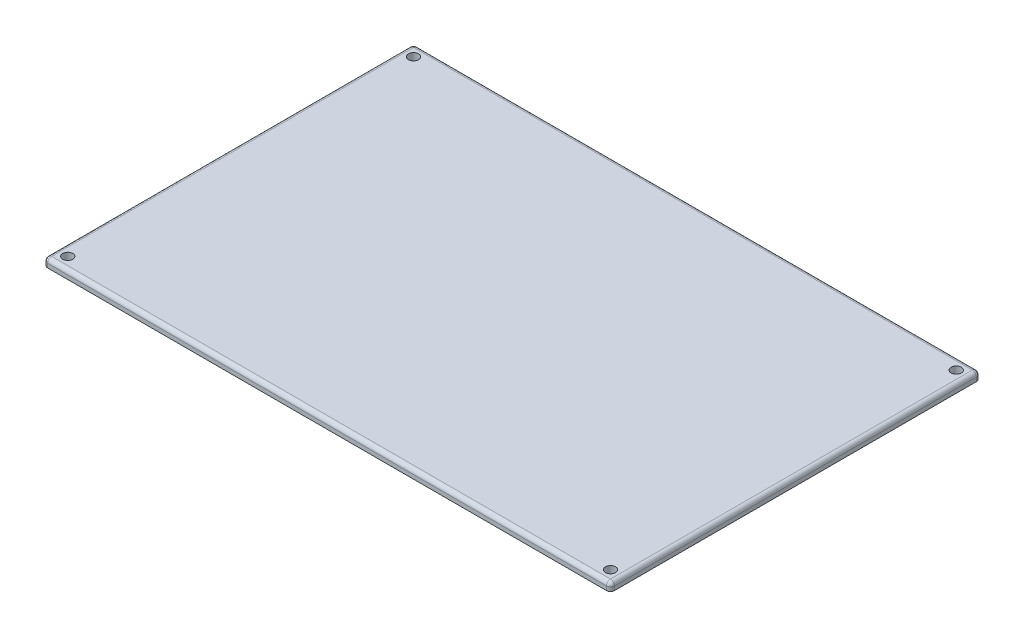
ISO-10303-21;
HEADER;
FILE_DESCRIPTION(('STEP AP214'),'2;1');
FILE_NAME('part.step','',(''),(''),'','','');
FILE_SCHEMA(('AUTOMOTIVE_DESIGN { 1 0 10303 214 1 1 1 1 }'));
ENDSEC;
DATA;
#1=APPLICATION_CONTEXT('core data for automotive mechanical design processes');
#2=APPLICATION_PROTOCOL_DEFINITION('international standard','automotive_design',2000,#1);
#3=PRODUCT_CONTEXT('',#1,'mechanical');
#4=PRODUCT('Part','Part','',(#3));
#5=PRODUCT_RELATED_PRODUCT_CATEGORY('part','',(#4));
#6=PRODUCT_DEFINITION_FORMATION('','',#4);
#7=PRODUCT_DEFINITION_CONTEXT('part definition',#1,'design');
#8=PRODUCT_DEFINITION('design','',#6,#7);
#9=PRODUCT_DEFINITION_SHAPE('','',#8);
#10=(LENGTH_UNIT() NAMED_UNIT(*) SI_UNIT(.MILLI.,.METRE.));
#11=(NAMED_UNIT(*) PLANE_ANGLE_UNIT() SI_UNIT($,.RADIAN.));
#12=(NAMED_UNIT(*) SI_UNIT($,.STERADIAN.) SOLID_ANGLE_UNIT());
#13=UNCERTAINTY_MEASURE_WITH_UNIT(LENGTH_MEASURE(1.E-05),#10,'distance_accuracy_value','');
#14=(GEOMETRIC_REPRESENTATION_CONTEXT(3) GLOBAL_UNCERTAINTY_ASSIGNED_CONTEXT((#13)) GLOBAL_UNIT_ASSIGNED_CONTEXT((#10,
#11,#12)) REPRESENTATION_CONTEXT('',''));
#15=CARTESIAN_POINT('',(0.,0.,0.));
#16=DIRECTION('',(0.,0.,1.));
#17=DIRECTION('',(1.,0.,0.));
#18=AXIS2_PLACEMENT_3D('',#15,#16,#17);
#19=CARTESIAN_POINT('',(0.,0.,0.));
#20=DIRECTION('',(0.,-1.,0.));
#21=DIRECTION('',(0.,0.,-1.));
#22=AXIS2_PLACEMENT_3D('',#19,#20,#21);
#23=PLANE('',#22);
#24=CARTESIAN_POINT('',(3.,0.,-89.));
#25=DIRECTION('',(0.,-1.,0.));
#26=DIRECTION('',(0.,0.,1.));
#27=AXIS2_PLACEMENT_3D('',#24,#25,#26);
#28=CIRCLE('',#27,1.26);
#29=CARTESIAN_POINT('',(3.,0.,-87.74));
#30=VERTEX_POINT('',#29);
#31=EDGE_CURVE('E277',#30,#30,#28,.T.);
#32=ORIENTED_EDGE('',*,*,#31,.F.);
#33=EDGE_LOOP('',(#32));
#34=FACE_BOUND('',#33,.T.);
#35=CARTESIAN_POINT('',(138.,0.,-89.));
#36=DIRECTION('',(0.,-1.,0.));
#37=DIRECTION('',(0.,0.,-1.));
#38=AXIS2_PLACEMENT_3D('',#35,#36,#37);
#39=CIRCLE('',#38,1.26);
#40=CARTESIAN_POINT('',(138.,0.,-90.26));
#41=VERTEX_POINT('',#40);
#42=EDGE_CURVE('E283',#41,#41,#39,.T.);
#43=ORIENTED_EDGE('',*,*,#42,.F.);
#44=EDGE_LOOP('',(#43));
#45=FACE_BOUND('',#44,.T.);
#46=CARTESIAN_POINT('',(138.,0.,-3.));
#47=DIRECTION('',(0.,-1.,0.));
#48=DIRECTION('',(0.,0.,1.));
#49=AXIS2_PLACEMENT_3D('',#46,#47,#48);
#50=CIRCLE('',#49,1.25999999999999);
#51=CARTESIAN_POINT('',(138.,0.,-1.74000000000001));
#52=VERTEX_POINT('',#51);
#53=EDGE_CURVE('E278',#52,#52,#50,.T.);
#54=ORIENTED_EDGE('',*,*,#53,.F.);
#55=EDGE_LOOP('',(#54));
#56=FACE_BOUND('',#55,.T.);
#57=CARTESIAN_POINT('',(3.,0.,-3.));
#58=DIRECTION('',(0.,-1.,0.));
#59=DIRECTION('',(0.,0.,-1.));
#60=AXIS2_PLACEMENT_3D('',#57,#58,#59);
#61=CIRCLE('',#60,1.26);
#62=CARTESIAN_POINT('',(3.,0.,-4.26));
#63=VERTEX_POINT('',#62);
#64=EDGE_CURVE('E282',#63,#63,#61,.T.);
#65=ORIENTED_EDGE('',*,*,#64,.F.);
#66=EDGE_LOOP('',(#65));
#67=FACE_BOUND('',#66,.T.);
#68=DIRECTION('',(1.,0.,0.));
#69=VECTOR('',#68,1.);
#70=CARTESIAN_POINT('',(0.,0.,0.));
#71=LINE('',#70,#69);
#72=CARTESIAN_POINT('',(1.,0.,0.));
#73=VERTEX_POINT('',#72);
#74=CARTESIAN_POINT('',(140.,0.,0.));
#75=VERTEX_POINT('',#74);
#76=EDGE_CURVE('E313',#73,#75,#71,.T.);
#77=ORIENTED_EDGE('',*,*,#76,.F.);
#78=CARTESIAN_POINT('',(1.,0.,-1.));
#79=DIRECTION('',(0.,-1.,0.));
#80=DIRECTION('',(0.,0.,-1.));
#81=AXIS2_PLACEMENT_3D('',#78,#79,#80);
#82=CIRCLE('',#81,1.);
#83=CARTESIAN_POINT('',(0.,0.,-1.));
#84=VERTEX_POINT('',#83);
#85=EDGE_CURVE('E397',#73,#84,#82,.T.);
#86=ORIENTED_EDGE('',*,*,#85,.T.);
#87=DIRECTION('',(0.,0.,1.));
#88=VECTOR('',#87,1.);
#89=CARTESIAN_POINT('',(0.,0.,0.));
#90=LINE('',#89,#88);
#91=CARTESIAN_POINT('',(0.,0.,-91.));
#92=VERTEX_POINT('',#91);
#93=EDGE_CURVE('E309',#92,#84,#90,.T.);
#94=ORIENTED_EDGE('',*,*,#93,.F.);
#95=CARTESIAN_POINT('',(1.,0.,-91.));
#96=DIRECTION('',(0.,-1.,0.));
#97=DIRECTION('',(0.,0.,-1.));
#98=AXIS2_PLACEMENT_3D('',#95,#96,#97);
#99=CIRCLE('',#98,1.);
#100=CARTESIAN_POINT('',(1.,0.,-92.));
#101=VERTEX_POINT('',#100);
#102=EDGE_CURVE('E389',#92,#101,#99,.T.);
#103=ORIENTED_EDGE('',*,*,#102,.T.);
#104=DIRECTION('',(-1.,0.,0.));
#105=VECTOR('',#104,1.);
#106=CARTESIAN_POINT('',(0.,0.,-92.));
#107=LINE('',#106,#105);
#108=CARTESIAN_POINT('',(140.,0.,-92.));
#109=VERTEX_POINT('',#108);
#110=EDGE_CURVE('E320',#109,#101,#107,.T.);
#111=ORIENTED_EDGE('',*,*,#110,.F.);
#112=CARTESIAN_POINT('',(140.,0.,-91.));
#113=DIRECTION('',(0.,-1.,0.));
#114=DIRECTION('',(0.,0.,-1.));
#115=AXIS2_PLACEMENT_3D('',#112,#113,#114);
#116=CIRCLE('',#115,1.);
#117=CARTESIAN_POINT('',(141.,0.,-91.));
#118=VERTEX_POINT('',#117);
#119=EDGE_CURVE('E67',#109,#118,#116,.T.);
#120=ORIENTED_EDGE('',*,*,#119,.T.);
#121=DIRECTION('',(0.,0.,-1.));
#122=VECTOR('',#121,1.);
#123=CARTESIAN_POINT('',(141.,0.,0.));
#124=LINE('',#123,#122);
#125=CARTESIAN_POINT('',(141.,0.,-1.));
#126=VERTEX_POINT('',#125);
#127=EDGE_CURVE('E317',#126,#118,#124,.T.);
#128=ORIENTED_EDGE('',*,*,#127,.F.);
#129=CARTESIAN_POINT('',(140.,0.,-1.));
#130=DIRECTION('',(0.,-1.,0.));
#131=DIRECTION('',(0.,0.,-1.));
#132=AXIS2_PLACEMENT_3D('',#129,#130,#131);
#133=CIRCLE('',#132,1.);
#134=EDGE_CURVE('E394',#126,#75,#133,.T.);
#135=ORIENTED_EDGE('',*,*,#134,.T.);
#136=EDGE_LOOP('',(#77,#86,#94,#103,#111,#120,#128,#135));
#137=FACE_BOUND('',#136,.T.);
#138=CARTESIAN_POINT('',(3.,0.,-3.));
#139=DIRECTION('',(0.,-1.,0.));
#140=DIRECTION('',(0.,0.,-1.));
#141=AXIS2_PLACEMENT_3D('',#138,#139,#140);
#142=CIRCLE('',#141,2.76);
#143=CARTESIAN_POINT('',(1.5,0.,-5.31680814915694));
#144=VERTEX_POINT('',#143);
#145=CARTESIAN_POINT('',(5.31680814915694,0.,-1.5));
#146=VERTEX_POINT('',#145);
#147=EDGE_CURVE('E230',#144,#146,#142,.T.);
#148=ORIENTED_EDGE('',*,*,#147,.T.);
#149=DIRECTION('',(1.,0.,0.));
#150=VECTOR('',#149,1.);
#151=CARTESIAN_POINT('',(0.,0.,-1.5));
#152=LINE('',#151,#150);
#153=CARTESIAN_POINT('',(135.683191850843,0.,-1.5));
#154=VERTEX_POINT('',#153);
#155=EDGE_CURVE('E233',#146,#154,#152,.T.);
#156=ORIENTED_EDGE('',*,*,#155,.T.);
#157=CARTESIAN_POINT('',(138.,0.,-3.));
#158=DIRECTION('',(0.,-1.,0.));
#159=DIRECTION('',(0.,0.,-1.));
#160=AXIS2_PLACEMENT_3D('',#157,#158,#159);
#161=CIRCLE('',#160,2.75999999999999);
#162=CARTESIAN_POINT('',(139.5,0.,-5.31680814915695));
#163=VERTEX_POINT('',#162);
#164=EDGE_CURVE('E247',#154,#163,#161,.T.);
#165=ORIENTED_EDGE('',*,*,#164,.T.);
#166=DIRECTION('',(0.,0.,-1.));
#167=VECTOR('',#166,1.);
#168=CARTESIAN_POINT('',(139.5,0.,0.));
#169=LINE('',#168,#167);
#170=CARTESIAN_POINT('',(139.5,0.,-86.683191850843));
#171=VERTEX_POINT('',#170);
#172=EDGE_CURVE('E237',#163,#171,#169,.T.);
#173=ORIENTED_EDGE('',*,*,#172,.T.);
#174=CARTESIAN_POINT('',(138.,0.,-89.));
#175=DIRECTION('',(0.,-1.,0.));
#176=DIRECTION('',(0.,0.,-1.));
#177=AXIS2_PLACEMENT_3D('',#174,#175,#176);
#178=CIRCLE('',#177,2.75999999999999);
#179=CARTESIAN_POINT('',(135.683191850843,0.,-90.5));
#180=VERTEX_POINT('',#179);
#181=EDGE_CURVE('E251',#171,#180,#178,.T.);
#182=ORIENTED_EDGE('',*,*,#181,.T.);
#183=DIRECTION('',(-1.,0.,0.));
#184=VECTOR('',#183,1.);
#185=CARTESIAN_POINT('',(0.,0.,-90.5));
#186=LINE('',#185,#184);
#187=CARTESIAN_POINT('',(5.31680814915694,0.,-90.5));
#188=VERTEX_POINT('',#187);
#189=EDGE_CURVE('E219',#180,#188,#186,.T.);
#190=ORIENTED_EDGE('',*,*,#189,.T.);
#191=CARTESIAN_POINT('',(3.,0.,-89.));
#192=DIRECTION('',(0.,-1.,0.));
#193=DIRECTION('',(0.,0.,-1.));
#194=AXIS2_PLACEMENT_3D('',#191,#192,#193);
#195=CIRCLE('',#194,2.76);
#196=CARTESIAN_POINT('',(1.5,0.,-86.6831918508431));
#197=VERTEX_POINT('',#196);
#198=EDGE_CURVE('E255',#188,#197,#195,.T.);
#199=ORIENTED_EDGE('',*,*,#198,.T.);
#200=DIRECTION('',(0.,0.,1.));
#201=VECTOR('',#200,1.);
#202=CARTESIAN_POINT('',(1.5,0.,0.));
#203=LINE('',#202,#201);
#204=EDGE_CURVE('E184',#197,#144,#203,.T.);
#205=ORIENTED_EDGE('',*,*,#204,.T.);
#206=EDGE_LOOP('',(#148,#156,#165,#173,#182,#190,#199,#205));
#207=FACE_BOUND('',#206,.T.);
#208=ADVANCED_FACE('F49',(#34,#45,#56,#67,#137,#207),#23,.T.);
#209=CARTESIAN_POINT('',(0.,2.,0.));
#210=DIRECTION('',(1.,0.,0.));
#211=DIRECTION('',(0.,0.,-1.));
#212=AXIS2_PLACEMENT_3D('',#209,#210,#211);
#213=PLANE('',#212);
#214=ORIENTED_EDGE('',*,*,#93,.T.);
#215=DIRECTION('',(0.,-1.,0.));
#216=VECTOR('',#215,1.);
#217=CARTESIAN_POINT('',(0.,2.,-1.));
#218=LINE('',#217,#216);
#219=CARTESIAN_POINT('',(0.,1.,-1.));
#220=VERTEX_POINT('',#219);
#221=EDGE_CURVE('E403',#84,#220,#218,.F.);
#222=ORIENTED_EDGE('',*,*,#221,.T.);
#223=DIRECTION('',(0.,0.,1.));
#224=VECTOR('',#223,1.);
#225=CARTESIAN_POINT('',(0.,1.,0.));
#226=LINE('',#225,#224);
#227=CARTESIAN_POINT('',(0.,1.,-91.));
#228=VERTEX_POINT('',#227);
#229=EDGE_CURVE('E347',#220,#228,#226,.F.);
#230=ORIENTED_EDGE('',*,*,#229,.T.);
#231=DIRECTION('',(0.,-1.,0.));
#232=VECTOR('',#231,1.);
#233=CARTESIAN_POINT('',(0.,2.,-91.));
#234=LINE('',#233,#232);
#235=EDGE_CURVE('E400',#228,#92,#234,.T.);
#236=ORIENTED_EDGE('',*,*,#235,.T.);
#237=EDGE_LOOP('',(#214,#222,#230,#236));
#238=FACE_BOUND('',#237,.T.);
#239=ADVANCED_FACE('F435',(#238),#213,.F.);
#240=CARTESIAN_POINT('',(0.,2.,0.));
#241=DIRECTION('',(0.,0.,-1.));
#242=DIRECTION('',(-1.,0.,0.));
#243=AXIS2_PLACEMENT_3D('',#240,#241,#242);
#244=PLANE('',#243);
#245=DIRECTION('',(1.,0.,0.));
#246=VECTOR('',#245,1.);
#247=CARTESIAN_POINT('',(0.,1.,0.));
#248=LINE('',#247,#246);
#249=CARTESIAN_POINT('',(140.,1.,0.));
#250=VERTEX_POINT('',#249);
#251=CARTESIAN_POINT('',(1.,1.,0.));
#252=VERTEX_POINT('',#251);
#253=EDGE_CURVE('E351',#250,#252,#248,.F.);
#254=ORIENTED_EDGE('',*,*,#253,.T.);
#255=DIRECTION('',(0.,-1.,0.));
#256=VECTOR('',#255,1.);
#257=CARTESIAN_POINT('',(1.,2.,0.));
#258=LINE('',#257,#256);
#259=EDGE_CURVE('E386',#252,#73,#258,.T.);
#260=ORIENTED_EDGE('',*,*,#259,.T.);
#261=ORIENTED_EDGE('',*,*,#76,.T.);
#262=DIRECTION('',(0.,-1.,0.));
#263=VECTOR('',#262,1.);
#264=CARTESIAN_POINT('',(140.,2.,0.));
#265=LINE('',#264,#263);
#266=EDGE_CURVE('E383',#75,#250,#265,.F.);
#267=ORIENTED_EDGE('',*,*,#266,.T.);
#268=EDGE_LOOP('',(#254,#260,#261,#267));
#269=FACE_BOUND('',#268,.T.);
#270=ADVANCED_FACE('F458',(#269),#244,.F.);
#271=CARTESIAN_POINT('',(141.,2.,0.));
#272=DIRECTION('',(-1.,0.,0.));
#273=DIRECTION('',(0.,0.,1.));
#274=AXIS2_PLACEMENT_3D('',#271,#272,#273);
#275=PLANE('',#274);
#276=DIRECTION('',(0.,0.,-1.));
#277=VECTOR('',#276,1.);
#278=CARTESIAN_POINT('',(141.,1.,0.));
#279=LINE('',#278,#277);
#280=CARTESIAN_POINT('',(141.,1.,-91.));
#281=VERTEX_POINT('',#280);
#282=CARTESIAN_POINT('',(141.,1.,-1.));
#283=VERTEX_POINT('',#282);
#284=EDGE_CURVE('E340',#281,#283,#279,.F.);
#285=ORIENTED_EDGE('',*,*,#284,.T.);
#286=DIRECTION('',(0.,-1.,0.));
#287=VECTOR('',#286,1.);
#288=CARTESIAN_POINT('',(141.,2.,-1.));
#289=LINE('',#288,#287);
#290=EDGE_CURVE('E74',#283,#126,#289,.T.);
#291=ORIENTED_EDGE('',*,*,#290,.T.);
#292=ORIENTED_EDGE('',*,*,#127,.T.);
#293=DIRECTION('',(0.,-1.,0.));
#294=VECTOR('',#293,1.);
#295=CARTESIAN_POINT('',(141.,2.,-91.));
#296=LINE('',#295,#294);
#297=EDGE_CURVE('E406',#118,#281,#296,.F.);
#298=ORIENTED_EDGE('',*,*,#297,.T.);
#299=EDGE_LOOP('',(#285,#291,#292,#298));
#300=FACE_BOUND('',#299,.T.);
#301=ADVANCED_FACE('F484',(#300),#275,.F.);
#302=CARTESIAN_POINT('',(0.,2.,-92.));
#303=DIRECTION('',(0.,0.,1.));
#304=DIRECTION('',(1.,0.,0.));
#305=AXIS2_PLACEMENT_3D('',#302,#303,#304);
#306=PLANE('',#305);
#307=DIRECTION('',(-1.,0.,0.));
#308=VECTOR('',#307,1.);
#309=CARTESIAN_POINT('',(0.,1.,-92.));
#310=LINE('',#309,#308);
#311=CARTESIAN_POINT('',(1.,1.,-92.));
#312=VERTEX_POINT('',#311);
#313=CARTESIAN_POINT('',(140.,1.,-92.));
#314=VERTEX_POINT('',#313);
#315=EDGE_CURVE('E343',#312,#314,#310,.F.);
#316=ORIENTED_EDGE('',*,*,#315,.T.);
#317=DIRECTION('',(0.,-1.,0.));
#318=VECTOR('',#317,1.);
#319=CARTESIAN_POINT('',(140.,2.,-92.));
#320=LINE('',#319,#318);
#321=EDGE_CURVE('E11',#314,#109,#320,.T.);
#322=ORIENTED_EDGE('',*,*,#321,.T.);
#323=ORIENTED_EDGE('',*,*,#110,.T.);
#324=DIRECTION('',(0.,-1.,0.));
#325=VECTOR('',#324,1.);
#326=CARTESIAN_POINT('',(1.,2.,-92.));
#327=LINE('',#326,#325);
#328=EDGE_CURVE('E59',#101,#312,#327,.F.);
#329=ORIENTED_EDGE('',*,*,#328,.T.);
#330=EDGE_LOOP('',(#316,#322,#323,#329));
#331=FACE_BOUND('',#330,.T.);
#332=ADVANCED_FACE('F480',(#331),#306,.F.);
#333=CARTESIAN_POINT('',(0.,2.,0.));
#334=DIRECTION('',(0.,-1.,0.));
#335=DIRECTION('',(0.,0.,-1.));
#336=AXIS2_PLACEMENT_3D('',#333,#334,#335);
#337=PLANE('',#336);
#338=DIRECTION('',(1.,0.,0.));
#339=VECTOR('',#338,1.);
#340=CARTESIAN_POINT('',(0.,2.,-1.));
#341=LINE('',#340,#339);
#342=CARTESIAN_POINT('',(1.,2.,-1.));
#343=VERTEX_POINT('',#342);
#344=CARTESIAN_POINT('',(140.,2.,-1.));
#345=VERTEX_POINT('',#344);
#346=EDGE_CURVE('E324',#343,#345,#341,.T.);
#347=ORIENTED_EDGE('',*,*,#346,.T.);
#348=DIRECTION('',(0.,0.,-1.));
#349=VECTOR('',#348,1.);
#350=CARTESIAN_POINT('',(140.,2.,0.));
#351=LINE('',#350,#349);
#352=CARTESIAN_POINT('',(140.,2.,-91.));
#353=VERTEX_POINT('',#352);
#354=EDGE_CURVE('E336',#345,#353,#351,.T.);
#355=ORIENTED_EDGE('',*,*,#354,.T.);
#356=DIRECTION('',(-1.,0.,0.));
#357=VECTOR('',#356,1.);
#358=CARTESIAN_POINT('',(0.,2.,-91.));
#359=LINE('',#358,#357);
#360=CARTESIAN_POINT('',(1.,2.,-91.));
#361=VERTEX_POINT('',#360);
#362=EDGE_CURVE('E332',#353,#361,#359,.T.);
#363=ORIENTED_EDGE('',*,*,#362,.T.);
#364=DIRECTION('',(0.,0.,1.));
#365=VECTOR('',#364,1.);
#366=CARTESIAN_POINT('',(1.,2.,0.));
#367=LINE('',#366,#365);
#368=EDGE_CURVE('E328',#361,#343,#367,.T.);
#369=ORIENTED_EDGE('',*,*,#368,.T.);
#370=EDGE_LOOP('',(#347,#355,#363,#369));
#371=FACE_BOUND('',#370,.T.);
#372=CARTESIAN_POINT('',(3.,2.,-89.));
#373=DIRECTION('',(0.,-1.,0.));
#374=DIRECTION('',(0.,0.,-1.));
#375=AXIS2_PLACEMENT_3D('',#372,#373,#374);
#376=CIRCLE('',#375,1.26);
#377=CARTESIAN_POINT('',(3.,2.,-90.26));
#378=VERTEX_POINT('',#377);
#379=EDGE_CURVE('E305',#378,#378,#376,.T.);
#380=ORIENTED_EDGE('',*,*,#379,.T.);
#381=EDGE_LOOP('',(#380));
#382=FACE_BOUND('',#381,.T.);
#383=CARTESIAN_POINT('',(138.,2.,-89.));
#384=DIRECTION('',(0.,-1.,0.));
#385=DIRECTION('',(0.,0.,-1.));
#386=AXIS2_PLACEMENT_3D('',#383,#384,#385);
#387=CIRCLE('',#386,1.26);
#388=CARTESIAN_POINT('',(138.,2.,-90.26));
#389=VERTEX_POINT('',#388);
#390=EDGE_CURVE('E301',#389,#389,#387,.T.);
#391=ORIENTED_EDGE('',*,*,#390,.T.);
#392=EDGE_LOOP('',(#391));
#393=FACE_BOUND('',#392,.T.);
#394=CARTESIAN_POINT('',(138.,2.,-3.));
#395=DIRECTION('',(0.,-1.,0.));
#396=DIRECTION('',(0.,0.,-1.));
#397=AXIS2_PLACEMENT_3D('',#394,#395,#396);
#398=CIRCLE('',#397,1.25999999999999);
#399=CARTESIAN_POINT('',(138.,2.,-4.25999999999999));
#400=VERTEX_POINT('',#399);
#401=EDGE_CURVE('E297',#400,#400,#398,.T.);
#402=ORIENTED_EDGE('',*,*,#401,.T.);
#403=EDGE_LOOP('',(#402));
#404=FACE_BOUND('',#403,.T.);
#405=CARTESIAN_POINT('',(3.,2.,-3.));
#406=DIRECTION('',(0.,-1.,0.));
#407=DIRECTION('',(0.,0.,-1.));
#408=AXIS2_PLACEMENT_3D('',#405,#406,#407);
#409=CIRCLE('',#408,1.26);
#410=CARTESIAN_POINT('',(3.,2.,-4.26));
#411=VERTEX_POINT('',#410);
#412=EDGE_CURVE('E293',#411,#411,#409,.T.);
#413=ORIENTED_EDGE('',*,*,#412,.T.);
#414=EDGE_LOOP('',(#413));
#415=FACE_BOUND('',#414,.T.);
#416=ADVANCED_FACE('F469',(#371,#382,#393,#404,#415),#337,.F.);
#417=CARTESIAN_POINT('',(3.,10.,-3.));
#418=DIRECTION('',(0.,-1.,0.));
#419=DIRECTION('',(0.,0.,-1.));
#420=AXIS2_PLACEMENT_3D('',#417,#418,#419);
#421=CYLINDRICAL_SURFACE('',#420,1.26);
#422=ORIENTED_EDGE('',*,*,#64,.T.);
#423=EDGE_LOOP('',(#422));
#424=FACE_BOUND('',#423,.T.);
#425=ORIENTED_EDGE('',*,*,#412,.F.);
#426=EDGE_LOOP('',(#425));
#427=FACE_BOUND('',#426,.T.);
#428=ADVANCED_FACE('F506',(#424,#427),#421,.F.);
#429=CARTESIAN_POINT('',(138.,10.,-3.));
#430=DIRECTION('',(0.,-1.,0.));
#431=DIRECTION('',(0.,0.,-1.));
#432=AXIS2_PLACEMENT_3D('',#429,#430,#431);
#433=CYLINDRICAL_SURFACE('',#432,1.25999999999999);
#434=ORIENTED_EDGE('',*,*,#53,.T.);
#435=EDGE_LOOP('',(#434));
#436=FACE_BOUND('',#435,.T.);
#437=ORIENTED_EDGE('',*,*,#401,.F.);
#438=EDGE_LOOP('',(#437));
#439=FACE_BOUND('',#438,.T.);
#440=ADVANCED_FACE('F509',(#436,#439),#433,.F.);
#441=CARTESIAN_POINT('',(138.,10.,-89.));
#442=DIRECTION('',(0.,-1.,0.));
#443=DIRECTION('',(0.,0.,-1.));
#444=AXIS2_PLACEMENT_3D('',#441,#442,#443);
#445=CYLINDRICAL_SURFACE('',#444,1.26);
#446=ORIENTED_EDGE('',*,*,#42,.T.);
#447=EDGE_LOOP('',(#446));
#448=FACE_BOUND('',#447,.T.);
#449=ORIENTED_EDGE('',*,*,#390,.F.);
#450=EDGE_LOOP('',(#449));
#451=FACE_BOUND('',#450,.T.);
#452=ADVANCED_FACE('F514',(#448,#451),#445,.F.);
#453=CARTESIAN_POINT('',(3.,10.,-89.));
#454=DIRECTION('',(0.,-1.,0.));
#455=DIRECTION('',(0.,0.,-1.));
#456=AXIS2_PLACEMENT_3D('',#453,#454,#455);
#457=CYLINDRICAL_SURFACE('',#456,1.26);
#458=ORIENTED_EDGE('',*,*,#31,.T.);
#459=EDGE_LOOP('',(#458));
#460=FACE_BOUND('',#459,.T.);
#461=ORIENTED_EDGE('',*,*,#379,.F.);
#462=EDGE_LOOP('',(#461));
#463=FACE_BOUND('',#462,.T.);
#464=ADVANCED_FACE('F511',(#460,#463),#457,.F.);
#465=CARTESIAN_POINT('',(1.,1.,0.));
#466=DIRECTION('',(0.,0.,1.));
#467=DIRECTION('',(1.,0.,0.));
#468=AXIS2_PLACEMENT_3D('',#465,#466,#467);
#469=CYLINDRICAL_SURFACE('',#468,1.);
#470=ORIENTED_EDGE('',*,*,#229,.F.);
#471=CARTESIAN_POINT('',(1.,1.,-1.));
#472=DIRECTION('',(0.,0.,1.));
#473=DIRECTION('',(1.,0.,0.));
#474=AXIS2_PLACEMENT_3D('',#471,#472,#473);
#475=CIRCLE('',#474,1.);
#476=EDGE_CURVE('E365',#220,#343,#475,.F.);
#477=ORIENTED_EDGE('',*,*,#476,.T.);
#478=ORIENTED_EDGE('',*,*,#368,.F.);
#479=CARTESIAN_POINT('',(1.,1.,-91.));
#480=DIRECTION('',(0.,0.,1.));
#481=DIRECTION('',(1.,0.,0.));
#482=AXIS2_PLACEMENT_3D('',#479,#480,#481);
#483=CIRCLE('',#482,1.);
#484=EDGE_CURVE('E362',#361,#228,#483,.T.);
#485=ORIENTED_EDGE('',*,*,#484,.T.);
#486=EDGE_LOOP('',(#470,#477,#478,#485));
#487=FACE_BOUND('',#486,.T.);
#488=ADVANCED_FACE('F447',(#487),#469,.T.);
#489=CARTESIAN_POINT('',(0.,1.,-1.));
#490=DIRECTION('',(1.,0.,0.));
#491=DIRECTION('',(0.,0.,-1.));
#492=AXIS2_PLACEMENT_3D('',#489,#490,#491);
#493=CYLINDRICAL_SURFACE('',#492,1.);
#494=ORIENTED_EDGE('',*,*,#346,.F.);
#495=CARTESIAN_POINT('',(1.,1.,-1.));
#496=DIRECTION('',(1.,0.,0.));
#497=DIRECTION('',(0.,0.,-1.));
#498=AXIS2_PLACEMENT_3D('',#495,#496,#497);
#499=CIRCLE('',#498,1.);
#500=EDGE_CURVE('E358',#343,#252,#499,.T.);
#501=ORIENTED_EDGE('',*,*,#500,.T.);
#502=ORIENTED_EDGE('',*,*,#253,.F.);
#503=CARTESIAN_POINT('',(140.,1.,-1.));
#504=DIRECTION('',(1.,0.,0.));
#505=DIRECTION('',(0.,0.,-1.));
#506=AXIS2_PLACEMENT_3D('',#503,#504,#505);
#507=CIRCLE('',#506,1.);
#508=EDGE_CURVE('E355',#250,#345,#507,.F.);
#509=ORIENTED_EDGE('',*,*,#508,.T.);
#510=EDGE_LOOP('',(#494,#501,#502,#509));
#511=FACE_BOUND('',#510,.T.);
#512=ADVANCED_FACE('F455',(#511),#493,.T.);
#513=CARTESIAN_POINT('',(0.,1.,-91.));
#514=DIRECTION('',(-1.,0.,0.));
#515=DIRECTION('',(0.,0.,1.));
#516=AXIS2_PLACEMENT_3D('',#513,#514,#515);
#517=CYLINDRICAL_SURFACE('',#516,1.);
#518=ORIENTED_EDGE('',*,*,#362,.F.);
#519=CARTESIAN_POINT('',(140.,1.,-91.));
#520=DIRECTION('',(-1.,0.,0.));
#521=DIRECTION('',(0.,0.,1.));
#522=AXIS2_PLACEMENT_3D('',#519,#520,#521);
#523=CIRCLE('',#522,1.);
#524=EDGE_CURVE('E380',#353,#314,#523,.T.);
#525=ORIENTED_EDGE('',*,*,#524,.T.);
#526=ORIENTED_EDGE('',*,*,#315,.F.);
#527=CARTESIAN_POINT('',(1.,1.,-91.));
#528=DIRECTION('',(-1.,0.,0.));
#529=DIRECTION('',(0.,0.,1.));
#530=AXIS2_PLACEMENT_3D('',#527,#528,#529);
#531=CIRCLE('',#530,1.);
#532=EDGE_CURVE('E376',#312,#361,#531,.F.);
#533=ORIENTED_EDGE('',*,*,#532,.T.);
#534=EDGE_LOOP('',(#518,#525,#526,#533));
#535=FACE_BOUND('',#534,.T.);
#536=ADVANCED_FACE('F476',(#535),#517,.T.);
#537=CARTESIAN_POINT('',(140.,1.,0.));
#538=DIRECTION('',(0.,0.,-1.));
#539=DIRECTION('',(-1.,0.,0.));
#540=AXIS2_PLACEMENT_3D('',#537,#538,#539);
#541=CYLINDRICAL_SURFACE('',#540,1.);
#542=ORIENTED_EDGE('',*,*,#354,.F.);
#543=CARTESIAN_POINT('',(140.,1.,-1.));
#544=DIRECTION('',(0.,0.,-1.));
#545=DIRECTION('',(-1.,0.,0.));
#546=AXIS2_PLACEMENT_3D('',#543,#544,#545);
#547=CIRCLE('',#546,1.);
#548=EDGE_CURVE('E372',#345,#283,#547,.T.);
#549=ORIENTED_EDGE('',*,*,#548,.T.);
#550=ORIENTED_EDGE('',*,*,#284,.F.);
#551=CARTESIAN_POINT('',(140.,1.,-91.));
#552=DIRECTION('',(0.,0.,-1.));
#553=DIRECTION('',(-1.,0.,0.));
#554=AXIS2_PLACEMENT_3D('',#551,#552,#553);
#555=CIRCLE('',#554,1.);
#556=EDGE_CURVE('E368',#281,#353,#555,.F.);
#557=ORIENTED_EDGE('',*,*,#556,.T.);
#558=EDGE_LOOP('',(#542,#549,#550,#557));
#559=FACE_BOUND('',#558,.T.);
#560=ADVANCED_FACE('F472',(#559),#541,.T.);
#561=CARTESIAN_POINT('',(1.5,2.,0.));
#562=DIRECTION('',(1.,0.,0.));
#563=DIRECTION('',(0.,0.,-1.));
#564=AXIS2_PLACEMENT_3D('',#561,#562,#563);
#565=PLANE('',#564);
#566=DIRECTION('',(0.,-1.,0.));
#567=VECTOR('',#566,1.);
#568=CARTESIAN_POINT('',(1.5,10.,-86.6831918508431));
#569=LINE('',#568,#567);
#570=CARTESIAN_POINT('',(1.5,0.5,-86.6831918508431));
#571=VERTEX_POINT('',#570);
#572=EDGE_CURVE('E178',#197,#571,#569,.F.);
#573=ORIENTED_EDGE('',*,*,#572,.T.);
#574=DIRECTION('',(0.,0.,-1.));
#575=VECTOR('',#574,1.);
#576=CARTESIAN_POINT('',(1.5,0.5,0.));
#577=LINE('',#576,#575);
#578=CARTESIAN_POINT('',(1.5,0.5,-5.31680814915694));
#579=VERTEX_POINT('',#578);
#580=EDGE_CURVE('E182',#579,#571,#577,.T.);
#581=ORIENTED_EDGE('',*,*,#580,.F.);
#582=DIRECTION('',(0.,-1.,0.));
#583=VECTOR('',#582,1.);
#584=CARTESIAN_POINT('',(1.5,10.,-5.31680814915694));
#585=LINE('',#584,#583);
#586=EDGE_CURVE('E261',#144,#579,#585,.F.);
#587=ORIENTED_EDGE('',*,*,#586,.F.);
#588=ORIENTED_EDGE('',*,*,#204,.F.);
#589=EDGE_LOOP('',(#573,#581,#587,#588));
#590=FACE_BOUND('',#589,.T.);
#591=ADVANCED_FACE('F180',(#590),#565,.T.);
#592=CARTESIAN_POINT('',(0.,2.,-1.5));
#593=DIRECTION('',(0.,0.,-1.));
#594=DIRECTION('',(-1.,0.,0.));
#595=AXIS2_PLACEMENT_3D('',#592,#593,#594);
#596=PLANE('',#595);
#597=ORIENTED_EDGE('',*,*,#155,.F.);
#598=DIRECTION('',(0.,-1.,0.));
#599=VECTOR('',#598,1.);
#600=CARTESIAN_POINT('',(5.31680814915694,10.,-1.5));
#601=LINE('',#600,#599);
#602=CARTESIAN_POINT('',(5.31680814915694,0.5,-1.5));
#603=VERTEX_POINT('',#602);
#604=EDGE_CURVE('E212',#146,#603,#601,.F.);
#605=ORIENTED_EDGE('',*,*,#604,.T.);
#606=DIRECTION('',(-1.,0.,0.));
#607=VECTOR('',#606,1.);
#608=CARTESIAN_POINT('',(0.,0.5,-1.5));
#609=LINE('',#608,#607);
#610=CARTESIAN_POINT('',(135.683191850843,0.5,-1.5));
#611=VERTEX_POINT('',#610);
#612=EDGE_CURVE('E207',#611,#603,#609,.T.);
#613=ORIENTED_EDGE('',*,*,#612,.F.);
#614=DIRECTION('',(0.,-1.,0.));
#615=VECTOR('',#614,1.);
#616=CARTESIAN_POINT('',(135.683191850843,10.,-1.5));
#617=LINE('',#616,#615);
#618=EDGE_CURVE('E267',#154,#611,#617,.F.);
#619=ORIENTED_EDGE('',*,*,#618,.F.);
#620=EDGE_LOOP('',(#597,#605,#613,#619));
#621=FACE_BOUND('',#620,.T.);
#622=ADVANCED_FACE('F544',(#621),#596,.T.);
#623=CARTESIAN_POINT('',(139.5,2.,0.));
#624=DIRECTION('',(-1.,0.,0.));
#625=DIRECTION('',(0.,0.,1.));
#626=AXIS2_PLACEMENT_3D('',#623,#624,#625);
#627=PLANE('',#626);
#628=ORIENTED_EDGE('',*,*,#172,.F.);
#629=DIRECTION('',(0.,-1.,0.));
#630=VECTOR('',#629,1.);
#631=CARTESIAN_POINT('',(139.5,10.,-5.31680814915695));
#632=LINE('',#631,#630);
#633=CARTESIAN_POINT('',(139.5,0.5,-5.31680814915695));
#634=VERTEX_POINT('',#633);
#635=EDGE_CURVE('E264',#163,#634,#632,.F.);
#636=ORIENTED_EDGE('',*,*,#635,.T.);
#637=DIRECTION('',(0.,0.,1.));
#638=VECTOR('',#637,1.);
#639=CARTESIAN_POINT('',(139.5,0.5,0.));
#640=LINE('',#639,#638);
#641=CARTESIAN_POINT('',(139.5,0.5,-86.683191850843));
#642=VERTEX_POINT('',#641);
#643=EDGE_CURVE('E208',#642,#634,#640,.T.);
#644=ORIENTED_EDGE('',*,*,#643,.F.);
#645=DIRECTION('',(0.,-1.,0.));
#646=VECTOR('',#645,1.);
#647=CARTESIAN_POINT('',(139.5,10.,-86.683191850843));
#648=LINE('',#647,#646);
#649=EDGE_CURVE('E190',#171,#642,#648,.F.);
#650=ORIENTED_EDGE('',*,*,#649,.F.);
#651=EDGE_LOOP('',(#628,#636,#644,#650));
#652=FACE_BOUND('',#651,.T.);
#653=ADVANCED_FACE('F540',(#652),#627,.T.);
#654=CARTESIAN_POINT('',(0.,2.,-90.5));
#655=DIRECTION('',(0.,0.,1.));
#656=DIRECTION('',(1.,0.,0.));
#657=AXIS2_PLACEMENT_3D('',#654,#655,#656);
#658=PLANE('',#657);
#659=ORIENTED_EDGE('',*,*,#189,.F.);
#660=DIRECTION('',(0.,-1.,0.));
#661=VECTOR('',#660,1.);
#662=CARTESIAN_POINT('',(135.683191850843,10.,-90.5));
#663=LINE('',#662,#661);
#664=CARTESIAN_POINT('',(135.683191850843,0.5,-90.5));
#665=VERTEX_POINT('',#664);
#666=EDGE_CURVE('E270',#180,#665,#663,.F.);
#667=ORIENTED_EDGE('',*,*,#666,.T.);
#668=DIRECTION('',(-1.,0.,0.));
#669=VECTOR('',#668,1.);
#670=CARTESIAN_POINT('',(0.,0.5,-90.5));
#671=LINE('',#670,#669);
#672=CARTESIAN_POINT('',(5.31680814915694,0.5,-90.5));
#673=VERTEX_POINT('',#672);
#674=EDGE_CURVE('E215',#665,#673,#671,.T.);
#675=ORIENTED_EDGE('',*,*,#674,.T.);
#676=DIRECTION('',(0.,-1.,0.));
#677=VECTOR('',#676,1.);
#678=CARTESIAN_POINT('',(5.31680814915694,10.,-90.5));
#679=LINE('',#678,#677);
#680=EDGE_CURVE('E189',#188,#673,#679,.F.);
#681=ORIENTED_EDGE('',*,*,#680,.F.);
#682=EDGE_LOOP('',(#659,#667,#675,#681));
#683=FACE_BOUND('',#682,.T.);
#684=ADVANCED_FACE('F537',(#683),#658,.T.);
#685=CARTESIAN_POINT('',(0.,0.5,0.));
#686=DIRECTION('',(0.,-1.,0.));
#687=DIRECTION('',(0.,0.,-1.));
#688=AXIS2_PLACEMENT_3D('',#685,#686,#687);
#689=PLANE('',#688);
#690=CARTESIAN_POINT('',(3.,0.5,-3.));
#691=DIRECTION('',(0.,-1.,0.));
#692=DIRECTION('',(0.,0.,-1.));
#693=AXIS2_PLACEMENT_3D('',#690,#691,#692);
#694=CIRCLE('',#693,2.76);
#695=EDGE_CURVE('E205',#579,#603,#694,.T.);
#696=ORIENTED_EDGE('',*,*,#695,.F.);
#697=ORIENTED_EDGE('',*,*,#580,.T.);
#698=CARTESIAN_POINT('',(3.,0.5,-89.));
#699=DIRECTION('',(0.,-1.,0.));
#700=DIRECTION('',(0.,0.,-1.));
#701=AXIS2_PLACEMENT_3D('',#698,#699,#700);
#702=CIRCLE('',#701,2.76);
#703=EDGE_CURVE('E193',#673,#571,#702,.T.);
#704=ORIENTED_EDGE('',*,*,#703,.F.);
#705=ORIENTED_EDGE('',*,*,#674,.F.);
#706=CARTESIAN_POINT('',(138.,0.5,-89.));
#707=DIRECTION('',(0.,-1.,0.));
#708=DIRECTION('',(0.,0.,-1.));
#709=AXIS2_PLACEMENT_3D('',#706,#707,#708);
#710=CIRCLE('',#709,2.75999999999999);
#711=EDGE_CURVE('E199',#642,#665,#710,.T.);
#712=ORIENTED_EDGE('',*,*,#711,.F.);
#713=ORIENTED_EDGE('',*,*,#643,.T.);
#714=CARTESIAN_POINT('',(138.,0.5,-3.));
#715=DIRECTION('',(0.,-1.,0.));
#716=DIRECTION('',(0.,0.,-1.));
#717=AXIS2_PLACEMENT_3D('',#714,#715,#716);
#718=CIRCLE('',#717,2.75999999999999);
#719=EDGE_CURVE('E224',#611,#634,#718,.T.);
#720=ORIENTED_EDGE('',*,*,#719,.F.);
#721=ORIENTED_EDGE('',*,*,#612,.T.);
#722=EDGE_LOOP('',(#696,#697,#704,#705,#712,#713,#720,#721));
#723=FACE_BOUND('',#722,.T.);
#724=ADVANCED_FACE('F202',(#723),#689,.T.);
#725=CARTESIAN_POINT('',(3.,10.,-3.));
#726=DIRECTION('',(0.,-1.,0.));
#727=DIRECTION('',(0.,0.,-1.));
#728=AXIS2_PLACEMENT_3D('',#725,#726,#727);
#729=CYLINDRICAL_SURFACE('',#728,2.76);
#730=ORIENTED_EDGE('',*,*,#586,.T.);
#731=ORIENTED_EDGE('',*,*,#695,.T.);
#732=ORIENTED_EDGE('',*,*,#604,.F.);
#733=ORIENTED_EDGE('',*,*,#147,.F.);
#734=EDGE_LOOP('',(#730,#731,#732,#733));
#735=FACE_BOUND('',#734,.T.);
#736=ADVANCED_FACE('F530',(#735),#729,.T.);
#737=CARTESIAN_POINT('',(138.,10.,-3.));
#738=DIRECTION('',(0.,-1.,0.));
#739=DIRECTION('',(0.,0.,-1.));
#740=AXIS2_PLACEMENT_3D('',#737,#738,#739);
#741=CYLINDRICAL_SURFACE('',#740,2.75999999999999);
#742=ORIENTED_EDGE('',*,*,#618,.T.);
#743=ORIENTED_EDGE('',*,*,#719,.T.);
#744=ORIENTED_EDGE('',*,*,#635,.F.);
#745=ORIENTED_EDGE('',*,*,#164,.F.);
#746=EDGE_LOOP('',(#742,#743,#744,#745));
#747=FACE_BOUND('',#746,.T.);
#748=ADVANCED_FACE('F526',(#747),#741,.T.);
#749=CARTESIAN_POINT('',(138.,10.,-89.));
#750=DIRECTION('',(0.,-1.,0.));
#751=DIRECTION('',(0.,0.,-1.));
#752=AXIS2_PLACEMENT_3D('',#749,#750,#751);
#753=CYLINDRICAL_SURFACE('',#752,2.75999999999999);
#754=ORIENTED_EDGE('',*,*,#649,.T.);
#755=ORIENTED_EDGE('',*,*,#711,.T.);
#756=ORIENTED_EDGE('',*,*,#666,.F.);
#757=ORIENTED_EDGE('',*,*,#181,.F.);
#758=EDGE_LOOP('',(#754,#755,#756,#757));
#759=FACE_BOUND('',#758,.T.);
#760=ADVANCED_FACE('F523',(#759),#753,.T.);
#761=CARTESIAN_POINT('',(3.,10.,-89.));
#762=DIRECTION('',(0.,-1.,0.));
#763=DIRECTION('',(0.,0.,-1.));
#764=AXIS2_PLACEMENT_3D('',#761,#762,#763);
#765=CYLINDRICAL_SURFACE('',#764,2.76);
#766=ORIENTED_EDGE('',*,*,#680,.T.);
#767=ORIENTED_EDGE('',*,*,#703,.T.);
#768=ORIENTED_EDGE('',*,*,#572,.F.);
#769=ORIENTED_EDGE('',*,*,#198,.F.);
#770=EDGE_LOOP('',(#766,#767,#768,#769));
#771=FACE_BOUND('',#770,.T.);
#772=ADVANCED_FACE('F194',(#771),#765,.T.);
#773=CARTESIAN_POINT('',(1.,2.,-1.));
#774=DIRECTION('',(0.,-1.,0.));
#775=DIRECTION('',(0.,0.,-1.));
#776=AXIS2_PLACEMENT_3D('',#773,#774,#775);
#777=CYLINDRICAL_SURFACE('',#776,1.);
#778=ORIENTED_EDGE('',*,*,#85,.F.);
#779=ORIENTED_EDGE('',*,*,#259,.F.);
#780=CARTESIAN_POINT('',(1.,1.,-1.));
#781=DIRECTION('',(0.,1.,0.));
#782=DIRECTION('',(0.,0.,1.));
#783=AXIS2_PLACEMENT_3D('',#780,#781,#782);
#784=CIRCLE('',#783,1.);
#785=EDGE_CURVE('E258',#220,#252,#784,.T.);
#786=ORIENTED_EDGE('',*,*,#785,.F.);
#787=ORIENTED_EDGE('',*,*,#221,.F.);
#788=EDGE_LOOP('',(#778,#779,#786,#787));
#789=FACE_BOUND('',#788,.T.);
#790=ADVANCED_FACE('F443',(#789),#777,.T.);
#791=CARTESIAN_POINT('',(1.,1.,-1.));
#792=DIRECTION('',(0.,0.,1.));
#793=DIRECTION('',(1.,0.,0.));
#794=AXIS2_PLACEMENT_3D('',#791,#792,#793);
#795=SPHERICAL_SURFACE('',#794,1.);
#796=ORIENTED_EDGE('',*,*,#500,.F.);
#797=ORIENTED_EDGE('',*,*,#476,.F.);
#798=ORIENTED_EDGE('',*,*,#785,.T.);
#799=EDGE_LOOP('',(#796,#797,#798));
#800=FACE_BOUND('',#799,.T.);
#801=ADVANCED_FACE('F451',(#800),#795,.T.);
#802=CARTESIAN_POINT('',(140.,2.,-1.));
#803=DIRECTION('',(0.,-1.,0.));
#804=DIRECTION('',(0.,0.,-1.));
#805=AXIS2_PLACEMENT_3D('',#802,#803,#804);
#806=CYLINDRICAL_SURFACE('',#805,1.);
#807=ORIENTED_EDGE('',*,*,#134,.F.);
#808=ORIENTED_EDGE('',*,*,#290,.F.);
#809=CARTESIAN_POINT('',(140.,1.,-1.));
#810=DIRECTION('',(0.,1.,0.));
#811=DIRECTION('',(0.,0.,1.));
#812=AXIS2_PLACEMENT_3D('',#809,#810,#811);
#813=CIRCLE('',#812,1.);
#814=EDGE_CURVE('E415',#250,#283,#813,.T.);
#815=ORIENTED_EDGE('',*,*,#814,.F.);
#816=ORIENTED_EDGE('',*,*,#266,.F.);
#817=EDGE_LOOP('',(#807,#808,#815,#816));
#818=FACE_BOUND('',#817,.T.);
#819=ADVANCED_FACE('F463',(#818),#806,.T.);
#820=CARTESIAN_POINT('',(140.,1.,-1.));
#821=DIRECTION('',(0.,0.,1.));
#822=DIRECTION('',(1.,0.,0.));
#823=AXIS2_PLACEMENT_3D('',#820,#821,#822);
#824=SPHERICAL_SURFACE('',#823,1.);
#825=ORIENTED_EDGE('',*,*,#548,.F.);
#826=ORIENTED_EDGE('',*,*,#508,.F.);
#827=ORIENTED_EDGE('',*,*,#814,.T.);
#828=EDGE_LOOP('',(#825,#826,#827));
#829=FACE_BOUND('',#828,.T.);
#830=ADVANCED_FACE('F466',(#829),#824,.T.);
#831=CARTESIAN_POINT('',(140.,2.,-91.));
#832=DIRECTION('',(0.,-1.,0.));
#833=DIRECTION('',(0.,0.,-1.));
#834=AXIS2_PLACEMENT_3D('',#831,#832,#833);
#835=CYLINDRICAL_SURFACE('',#834,1.);
#836=ORIENTED_EDGE('',*,*,#119,.F.);
#837=ORIENTED_EDGE('',*,*,#321,.F.);
#838=CARTESIAN_POINT('',(140.,1.,-91.));
#839=DIRECTION('',(0.,1.,0.));
#840=DIRECTION('',(0.,0.,1.));
#841=AXIS2_PLACEMENT_3D('',#838,#839,#840);
#842=CIRCLE('',#841,1.);
#843=EDGE_CURVE('E417',#281,#314,#842,.T.);
#844=ORIENTED_EDGE('',*,*,#843,.F.);
#845=ORIENTED_EDGE('',*,*,#297,.F.);
#846=EDGE_LOOP('',(#836,#837,#844,#845));
#847=FACE_BOUND('',#846,.T.);
#848=ADVANCED_FACE('F482',(#847),#835,.T.);
#849=CARTESIAN_POINT('',(140.,1.,-91.));
#850=DIRECTION('',(0.,0.,1.));
#851=DIRECTION('',(1.,0.,0.));
#852=AXIS2_PLACEMENT_3D('',#849,#850,#851);
#853=SPHERICAL_SURFACE('',#852,1.);
#854=ORIENTED_EDGE('',*,*,#843,.T.);
#855=ORIENTED_EDGE('',*,*,#524,.F.);
#856=ORIENTED_EDGE('',*,*,#556,.F.);
#857=EDGE_LOOP('',(#854,#855,#856));
#858=FACE_BOUND('',#857,.T.);
#859=ADVANCED_FACE('F571',(#858),#853,.T.);
#860=CARTESIAN_POINT('',(1.,2.,-91.));
#861=DIRECTION('',(0.,-1.,0.));
#862=DIRECTION('',(0.,0.,-1.));
#863=AXIS2_PLACEMENT_3D('',#860,#861,#862);
#864=CYLINDRICAL_SURFACE('',#863,1.);
#865=ORIENTED_EDGE('',*,*,#102,.F.);
#866=ORIENTED_EDGE('',*,*,#235,.F.);
#867=CARTESIAN_POINT('',(1.,1.,-91.));
#868=DIRECTION('',(0.,1.,0.));
#869=DIRECTION('',(0.,0.,1.));
#870=AXIS2_PLACEMENT_3D('',#867,#868,#869);
#871=CIRCLE('',#870,1.);
#872=EDGE_CURVE('E53',#312,#228,#871,.T.);
#873=ORIENTED_EDGE('',*,*,#872,.F.);
#874=ORIENTED_EDGE('',*,*,#328,.F.);
#875=EDGE_LOOP('',(#865,#866,#873,#874));
#876=FACE_BOUND('',#875,.T.);
#877=ADVANCED_FACE('F51',(#876),#864,.T.);
#878=CARTESIAN_POINT('',(1.,1.,-91.));
#879=DIRECTION('',(0.,0.,1.));
#880=DIRECTION('',(1.,0.,0.));
#881=AXIS2_PLACEMENT_3D('',#878,#879,#880);
#882=SPHERICAL_SURFACE('',#881,1.);
#883=ORIENTED_EDGE('',*,*,#872,.T.);
#884=ORIENTED_EDGE('',*,*,#484,.F.);
#885=ORIENTED_EDGE('',*,*,#532,.F.);
#886=EDGE_LOOP('',(#883,#884,#885));
#887=FACE_BOUND('',#886,.T.);
#888=ADVANCED_FACE('F428',(#887),#882,.T.);
#889=CLOSED_SHELL('',(#208,#239,#270,#301,#332,#416,#428,#440,#452,#464,#488,#512,#536,#560,
#591,#622,#653,#684,#724,#736,#748,#760,#772,#790,#801,#819,#830,#848,#859,#877,#888));
#890=MANIFOLD_SOLID_BREP('B2',#889);
#891=ADVANCED_BREP_SHAPE_REPRESENTATION('',(#18,#890),#14);
#892=SHAPE_DEFINITION_REPRESENTATION(#9,#891);
ENDSEC;
END-ISO-10303-21;
